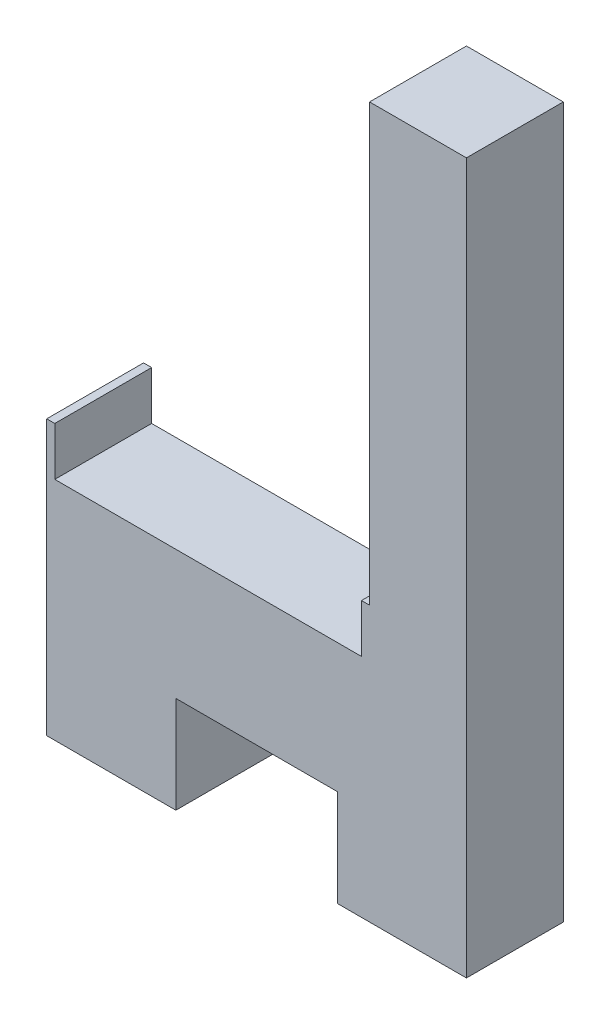
ISO-10303-21;
HEADER;
FILE_DESCRIPTION(('STEP AP214'),'2;1');
FILE_NAME('part.step','',(''),(''),'','','');
FILE_SCHEMA(('AUTOMOTIVE_DESIGN { 1 0 10303 214 1 1 1 1 }'));
ENDSEC;
DATA;
#1=APPLICATION_CONTEXT('core data for automotive mechanical design processes');
#2=APPLICATION_PROTOCOL_DEFINITION('international standard','automotive_design',2000,#1);
#3=PRODUCT_CONTEXT('',#1,'mechanical');
#4=PRODUCT('Part','Part','',(#3));
#5=PRODUCT_RELATED_PRODUCT_CATEGORY('part','',(#4));
#6=PRODUCT_DEFINITION_FORMATION('','',#4);
#7=PRODUCT_DEFINITION_CONTEXT('part definition',#1,'design');
#8=PRODUCT_DEFINITION('design','',#6,#7);
#9=PRODUCT_DEFINITION_SHAPE('','',#8);
#10=(LENGTH_UNIT() NAMED_UNIT(*) SI_UNIT(.MILLI.,.METRE.));
#11=(NAMED_UNIT(*) PLANE_ANGLE_UNIT() SI_UNIT($,.RADIAN.));
#12=(NAMED_UNIT(*) SI_UNIT($,.STERADIAN.) SOLID_ANGLE_UNIT());
#13=UNCERTAINTY_MEASURE_WITH_UNIT(LENGTH_MEASURE(1.E-05),#10,'distance_accuracy_value','');
#14=(GEOMETRIC_REPRESENTATION_CONTEXT(3) GLOBAL_UNCERTAINTY_ASSIGNED_CONTEXT((#13)) GLOBAL_UNIT_ASSIGNED_CONTEXT((#10,
#11,#12)) REPRESENTATION_CONTEXT('',''));
#15=CARTESIAN_POINT('',(0.,0.,0.));
#16=DIRECTION('',(0.,0.,1.));
#17=DIRECTION('',(1.,0.,0.));
#18=AXIS2_PLACEMENT_3D('',#15,#16,#17);
#19=CARTESIAN_POINT('',(5.,-22.,6.));
#20=DIRECTION('',(0.,1.,0.));
#21=DIRECTION('',(0.,0.,1.));
#22=AXIS2_PLACEMENT_3D('',#19,#20,#21);
#23=PLANE('',#22);
#24=DIRECTION('',(1.,0.,0.));
#25=VECTOR('',#24,1.);
#26=CARTESIAN_POINT('',(5.,-22.,0.));
#27=LINE('',#26,#25);
#28=CARTESIAN_POINT('',(5.,-22.,0.));
#29=VERTEX_POINT('',#28);
#30=CARTESIAN_POINT('',(13.,-22.,0.));
#31=VERTEX_POINT('',#30);
#32=EDGE_CURVE('E169',#29,#31,#27,.T.);
#33=ORIENTED_EDGE('',*,*,#32,.T.);
#34=DIRECTION('',(0.,0.,-1.));
#35=VECTOR('',#34,1.);
#36=CARTESIAN_POINT('',(13.,-22.,6.));
#37=LINE('',#36,#35);
#38=CARTESIAN_POINT('',(13.,-22.,6.));
#39=VERTEX_POINT('',#38);
#40=EDGE_CURVE('E11',#39,#31,#37,.T.);
#41=ORIENTED_EDGE('',*,*,#40,.F.);
#42=DIRECTION('',(1.,0.,0.));
#43=VECTOR('',#42,1.);
#44=CARTESIAN_POINT('',(5.,-22.,6.));
#45=LINE('',#44,#43);
#46=CARTESIAN_POINT('',(5.,-22.,6.));
#47=VERTEX_POINT('',#46);
#48=EDGE_CURVE('E195',#47,#39,#45,.T.);
#49=ORIENTED_EDGE('',*,*,#48,.F.);
#50=DIRECTION('',(0.,0.,-1.));
#51=VECTOR('',#50,1.);
#52=CARTESIAN_POINT('',(5.,-22.,6.));
#53=LINE('',#52,#51);
#54=EDGE_CURVE('E165',#47,#29,#53,.T.);
#55=ORIENTED_EDGE('',*,*,#54,.T.);
#56=EDGE_LOOP('',(#33,#41,#49,#55));
#57=FACE_BOUND('',#56,.T.);
#58=ADVANCED_FACE('F37',(#57),#23,.F.);
#59=CARTESIAN_POINT('',(13.,-22.,6.));
#60=DIRECTION('',(-1.,0.,0.));
#61=DIRECTION('',(0.,-1.,0.));
#62=AXIS2_PLACEMENT_3D('',#59,#60,#61);
#63=PLANE('',#62);
#64=DIRECTION('',(0.,1.,0.));
#65=VECTOR('',#64,1.);
#66=CARTESIAN_POINT('',(13.,-22.,0.));
#67=LINE('',#66,#65);
#68=CARTESIAN_POINT('',(13.,22.,0.));
#69=VERTEX_POINT('',#68);
#70=EDGE_CURVE('E172',#31,#69,#67,.T.);
#71=ORIENTED_EDGE('',*,*,#70,.T.);
#72=DIRECTION('',(0.,0.,-1.));
#73=VECTOR('',#72,1.);
#74=CARTESIAN_POINT('',(13.,22.,6.));
#75=LINE('',#74,#73);
#76=CARTESIAN_POINT('',(13.,22.,6.));
#77=VERTEX_POINT('',#76);
#78=EDGE_CURVE('E45',#77,#69,#75,.T.);
#79=ORIENTED_EDGE('',*,*,#78,.F.);
#80=DIRECTION('',(0.,1.,0.));
#81=VECTOR('',#80,1.);
#82=CARTESIAN_POINT('',(13.,-22.,6.));
#83=LINE('',#82,#81);
#84=EDGE_CURVE('E114',#39,#77,#83,.T.);
#85=ORIENTED_EDGE('',*,*,#84,.F.);
#86=ORIENTED_EDGE('',*,*,#40,.T.);
#87=EDGE_LOOP('',(#71,#79,#85,#86));
#88=FACE_BOUND('',#87,.T.);
#89=ADVANCED_FACE('F283',(#88),#63,.F.);
#90=CARTESIAN_POINT('',(13.,22.,6.));
#91=DIRECTION('',(0.,-1.,0.));
#92=DIRECTION('',(0.,0.,-1.));
#93=AXIS2_PLACEMENT_3D('',#90,#91,#92);
#94=PLANE('',#93);
#95=DIRECTION('',(-1.,0.,0.));
#96=VECTOR('',#95,1.);
#97=CARTESIAN_POINT('',(13.,22.,0.));
#98=LINE('',#97,#96);
#99=CARTESIAN_POINT('',(7.,22.,0.));
#100=VERTEX_POINT('',#99);
#101=EDGE_CURVE('E174',#69,#100,#98,.T.);
#102=ORIENTED_EDGE('',*,*,#101,.T.);
#103=DIRECTION('',(0.,0.,-1.));
#104=VECTOR('',#103,1.);
#105=CARTESIAN_POINT('',(7.,22.,6.));
#106=LINE('',#105,#104);
#107=CARTESIAN_POINT('',(7.,22.,6.));
#108=VERTEX_POINT('',#107);
#109=EDGE_CURVE('E220',#108,#100,#106,.T.);
#110=ORIENTED_EDGE('',*,*,#109,.F.);
#111=DIRECTION('',(-1.,0.,0.));
#112=VECTOR('',#111,1.);
#113=CARTESIAN_POINT('',(13.,22.,6.));
#114=LINE('',#113,#112);
#115=EDGE_CURVE('E228',#77,#108,#114,.T.);
#116=ORIENTED_EDGE('',*,*,#115,.F.);
#117=ORIENTED_EDGE('',*,*,#78,.T.);
#118=EDGE_LOOP('',(#102,#110,#116,#117));
#119=FACE_BOUND('',#118,.T.);
#120=ADVANCED_FACE('F226',(#119),#94,.F.);
#121=CARTESIAN_POINT('',(7.,22.,6.));
#122=DIRECTION('',(1.,0.,0.));
#123=DIRECTION('',(0.,0.,-1.));
#124=AXIS2_PLACEMENT_3D('',#121,#122,#123);
#125=PLANE('',#124);
#126=DIRECTION('',(0.,-1.,0.));
#127=VECTOR('',#126,1.);
#128=CARTESIAN_POINT('',(7.,22.,0.));
#129=LINE('',#128,#127);
#130=CARTESIAN_POINT('',(7.,-5.,0.));
#131=VERTEX_POINT('',#130);
#132=EDGE_CURVE('E176',#100,#131,#129,.T.);
#133=ORIENTED_EDGE('',*,*,#132,.T.);
#134=DIRECTION('',(0.,0.,-1.));
#135=VECTOR('',#134,1.);
#136=CARTESIAN_POINT('',(7.,-5.,6.));
#137=LINE('',#136,#135);
#138=CARTESIAN_POINT('',(7.,-5.,6.));
#139=VERTEX_POINT('',#138);
#140=EDGE_CURVE('E217',#139,#131,#137,.T.);
#141=ORIENTED_EDGE('',*,*,#140,.F.);
#142=DIRECTION('',(0.,-1.,0.));
#143=VECTOR('',#142,1.);
#144=CARTESIAN_POINT('',(7.,22.,6.));
#145=LINE('',#144,#143);
#146=EDGE_CURVE('E246',#108,#139,#145,.T.);
#147=ORIENTED_EDGE('',*,*,#146,.F.);
#148=ORIENTED_EDGE('',*,*,#109,.T.);
#149=EDGE_LOOP('',(#133,#141,#147,#148));
#150=FACE_BOUND('',#149,.T.);
#151=ADVANCED_FACE('F237',(#150),#125,.F.);
#152=CARTESIAN_POINT('',(7.,-5.,6.));
#153=DIRECTION('',(0.,-1.,0.));
#154=DIRECTION('',(0.,0.,-1.));
#155=AXIS2_PLACEMENT_3D('',#152,#153,#154);
#156=PLANE('',#155);
#157=DIRECTION('',(-1.,0.,0.));
#158=VECTOR('',#157,1.);
#159=CARTESIAN_POINT('',(7.,-5.,0.));
#160=LINE('',#159,#158);
#161=CARTESIAN_POINT('',(6.5,-5.,0.));
#162=VERTEX_POINT('',#161);
#163=EDGE_CURVE('E178',#131,#162,#160,.T.);
#164=ORIENTED_EDGE('',*,*,#163,.T.);
#165=DIRECTION('',(0.,0.,-1.));
#166=VECTOR('',#165,1.);
#167=CARTESIAN_POINT('',(6.5,-5.,6.));
#168=LINE('',#167,#166);
#169=CARTESIAN_POINT('',(6.5,-5.,6.));
#170=VERTEX_POINT('',#169);
#171=EDGE_CURVE('E214',#170,#162,#168,.T.);
#172=ORIENTED_EDGE('',*,*,#171,.F.);
#173=DIRECTION('',(-1.,0.,0.));
#174=VECTOR('',#173,1.);
#175=CARTESIAN_POINT('',(7.,-5.,6.));
#176=LINE('',#175,#174);
#177=EDGE_CURVE('E243',#139,#170,#176,.T.);
#178=ORIENTED_EDGE('',*,*,#177,.F.);
#179=ORIENTED_EDGE('',*,*,#140,.T.);
#180=EDGE_LOOP('',(#164,#172,#178,#179));
#181=FACE_BOUND('',#180,.T.);
#182=ADVANCED_FACE('F241',(#181),#156,.F.);
#183=CARTESIAN_POINT('',(6.5,-5.,6.));
#184=DIRECTION('',(1.,0.,0.));
#185=DIRECTION('',(0.,1.,0.));
#186=AXIS2_PLACEMENT_3D('',#183,#184,#185);
#187=PLANE('',#186);
#188=DIRECTION('',(0.,-1.,0.));
#189=VECTOR('',#188,1.);
#190=CARTESIAN_POINT('',(6.5,-5.,0.));
#191=LINE('',#190,#189);
#192=CARTESIAN_POINT('',(6.5,-7.99999999999999,0.));
#193=VERTEX_POINT('',#192);
#194=EDGE_CURVE('E180',#162,#193,#191,.T.);
#195=ORIENTED_EDGE('',*,*,#194,.T.);
#196=DIRECTION('',(0.,0.,-1.));
#197=VECTOR('',#196,1.);
#198=CARTESIAN_POINT('',(6.5,-7.99999999999999,6.));
#199=LINE('',#198,#197);
#200=CARTESIAN_POINT('',(6.5,-7.99999999999999,6.));
#201=VERTEX_POINT('',#200);
#202=EDGE_CURVE('E211',#201,#193,#199,.T.);
#203=ORIENTED_EDGE('',*,*,#202,.F.);
#204=DIRECTION('',(0.,-1.,0.));
#205=VECTOR('',#204,1.);
#206=CARTESIAN_POINT('',(6.5,-5.,6.));
#207=LINE('',#206,#205);
#208=EDGE_CURVE('E245',#170,#201,#207,.T.);
#209=ORIENTED_EDGE('',*,*,#208,.F.);
#210=ORIENTED_EDGE('',*,*,#171,.T.);
#211=EDGE_LOOP('',(#195,#203,#209,#210));
#212=FACE_BOUND('',#211,.T.);
#213=ADVANCED_FACE('F296',(#212),#187,.F.);
#214=CARTESIAN_POINT('',(6.5,-7.99999999999999,6.));
#215=DIRECTION('',(0.,-1.,0.));
#216=DIRECTION('',(1.,0.,0.));
#217=AXIS2_PLACEMENT_3D('',#214,#215,#216);
#218=PLANE('',#217);
#219=DIRECTION('',(-1.,0.,0.));
#220=VECTOR('',#219,1.);
#221=CARTESIAN_POINT('',(6.5,-7.99999999999999,0.));
#222=LINE('',#221,#220);
#223=CARTESIAN_POINT('',(-12.5,-7.99999999999999,0.));
#224=VERTEX_POINT('',#223);
#225=EDGE_CURVE('E182',#193,#224,#222,.T.);
#226=ORIENTED_EDGE('',*,*,#225,.T.);
#227=DIRECTION('',(0.,0.,-1.));
#228=VECTOR('',#227,1.);
#229=CARTESIAN_POINT('',(-12.5,-7.99999999999999,6.));
#230=LINE('',#229,#228);
#231=CARTESIAN_POINT('',(-12.5,-7.99999999999999,6.));
#232=VERTEX_POINT('',#231);
#233=EDGE_CURVE('E208',#232,#224,#230,.T.);
#234=ORIENTED_EDGE('',*,*,#233,.F.);
#235=DIRECTION('',(-1.,0.,0.));
#236=VECTOR('',#235,1.);
#237=CARTESIAN_POINT('',(6.5,-7.99999999999999,6.));
#238=LINE('',#237,#236);
#239=EDGE_CURVE('E248',#201,#232,#238,.T.);
#240=ORIENTED_EDGE('',*,*,#239,.F.);
#241=ORIENTED_EDGE('',*,*,#202,.T.);
#242=EDGE_LOOP('',(#226,#234,#240,#241));
#243=FACE_BOUND('',#242,.T.);
#244=ADVANCED_FACE('F299',(#243),#218,.F.);
#245=CARTESIAN_POINT('',(-12.5,-7.99999999999999,6.));
#246=DIRECTION('',(-1.,0.,0.));
#247=DIRECTION('',(0.,-1.,0.));
#248=AXIS2_PLACEMENT_3D('',#245,#246,#247);
#249=PLANE('',#248);
#250=DIRECTION('',(0.,1.,0.));
#251=VECTOR('',#250,1.);
#252=CARTESIAN_POINT('',(-12.5,-7.99999999999999,0.));
#253=LINE('',#252,#251);
#254=CARTESIAN_POINT('',(-12.5,-5.,0.));
#255=VERTEX_POINT('',#254);
#256=EDGE_CURVE('E184',#224,#255,#253,.T.);
#257=ORIENTED_EDGE('',*,*,#256,.T.);
#258=DIRECTION('',(0.,0.,-1.));
#259=VECTOR('',#258,1.);
#260=CARTESIAN_POINT('',(-12.5,-5.,6.));
#261=LINE('',#260,#259);
#262=CARTESIAN_POINT('',(-12.5,-5.,6.));
#263=VERTEX_POINT('',#262);
#264=EDGE_CURVE('E205',#263,#255,#261,.T.);
#265=ORIENTED_EDGE('',*,*,#264,.F.);
#266=DIRECTION('',(0.,1.,0.));
#267=VECTOR('',#266,1.);
#268=CARTESIAN_POINT('',(-12.5,-7.99999999999999,6.));
#269=LINE('',#268,#267);
#270=EDGE_CURVE('E254',#232,#263,#269,.T.);
#271=ORIENTED_EDGE('',*,*,#270,.F.);
#272=ORIENTED_EDGE('',*,*,#233,.T.);
#273=EDGE_LOOP('',(#257,#265,#271,#272));
#274=FACE_BOUND('',#273,.T.);
#275=ADVANCED_FACE('F303',(#274),#249,.F.);
#276=CARTESIAN_POINT('',(-12.5,-5.,6.));
#277=DIRECTION('',(0.,-1.,0.));
#278=DIRECTION('',(0.,0.,-1.));
#279=AXIS2_PLACEMENT_3D('',#276,#277,#278);
#280=PLANE('',#279);
#281=DIRECTION('',(-1.,0.,0.));
#282=VECTOR('',#281,1.);
#283=CARTESIAN_POINT('',(-12.5,-5.,0.));
#284=LINE('',#283,#282);
#285=CARTESIAN_POINT('',(-13.,-5.,0.));
#286=VERTEX_POINT('',#285);
#287=EDGE_CURVE('E186',#255,#286,#284,.T.);
#288=ORIENTED_EDGE('',*,*,#287,.T.);
#289=DIRECTION('',(0.,0.,-1.));
#290=VECTOR('',#289,1.);
#291=CARTESIAN_POINT('',(-13.,-5.,6.));
#292=LINE('',#291,#290);
#293=CARTESIAN_POINT('',(-13.,-5.,6.));
#294=VERTEX_POINT('',#293);
#295=EDGE_CURVE('E202',#294,#286,#292,.T.);
#296=ORIENTED_EDGE('',*,*,#295,.F.);
#297=DIRECTION('',(-1.,0.,0.));
#298=VECTOR('',#297,1.);
#299=CARTESIAN_POINT('',(-12.5,-5.,6.));
#300=LINE('',#299,#298);
#301=EDGE_CURVE('E256',#263,#294,#300,.T.);
#302=ORIENTED_EDGE('',*,*,#301,.F.);
#303=ORIENTED_EDGE('',*,*,#264,.T.);
#304=EDGE_LOOP('',(#288,#296,#302,#303));
#305=FACE_BOUND('',#304,.T.);
#306=ADVANCED_FACE('F307',(#305),#280,.F.);
#307=CARTESIAN_POINT('',(-13.,-5.,6.));
#308=DIRECTION('',(1.,0.,0.));
#309=DIRECTION('',(0.,0.,-1.));
#310=AXIS2_PLACEMENT_3D('',#307,#308,#309);
#311=PLANE('',#310);
#312=DIRECTION('',(0.,-1.,0.));
#313=VECTOR('',#312,1.);
#314=CARTESIAN_POINT('',(-13.,-5.,0.));
#315=LINE('',#314,#313);
#316=CARTESIAN_POINT('',(-13.,-22.,0.));
#317=VERTEX_POINT('',#316);
#318=EDGE_CURVE('E188',#286,#317,#315,.T.);
#319=ORIENTED_EDGE('',*,*,#318,.T.);
#320=DIRECTION('',(0.,0.,-1.));
#321=VECTOR('',#320,1.);
#322=CARTESIAN_POINT('',(-13.,-22.,6.));
#323=LINE('',#322,#321);
#324=CARTESIAN_POINT('',(-13.,-22.,6.));
#325=VERTEX_POINT('',#324);
#326=EDGE_CURVE('E199',#325,#317,#323,.T.);
#327=ORIENTED_EDGE('',*,*,#326,.F.);
#328=DIRECTION('',(0.,-1.,0.));
#329=VECTOR('',#328,1.);
#330=CARTESIAN_POINT('',(-13.,-5.,6.));
#331=LINE('',#330,#329);
#332=EDGE_CURVE('E258',#294,#325,#331,.T.);
#333=ORIENTED_EDGE('',*,*,#332,.F.);
#334=ORIENTED_EDGE('',*,*,#295,.T.);
#335=EDGE_LOOP('',(#319,#327,#333,#334));
#336=FACE_BOUND('',#335,.T.);
#337=ADVANCED_FACE('F264',(#336),#311,.F.);
#338=CARTESIAN_POINT('',(-13.,-22.,6.));
#339=DIRECTION('',(0.,1.,0.));
#340=DIRECTION('',(0.,0.,1.));
#341=AXIS2_PLACEMENT_3D('',#338,#339,#340);
#342=PLANE('',#341);
#343=DIRECTION('',(1.,0.,0.));
#344=VECTOR('',#343,1.);
#345=CARTESIAN_POINT('',(-13.,-22.,0.));
#346=LINE('',#345,#344);
#347=CARTESIAN_POINT('',(-5.,-22.,0.));
#348=VERTEX_POINT('',#347);
#349=EDGE_CURVE('E190',#317,#348,#346,.T.);
#350=ORIENTED_EDGE('',*,*,#349,.T.);
#351=DIRECTION('',(0.,0.,-1.));
#352=VECTOR('',#351,1.);
#353=CARTESIAN_POINT('',(-5.,-22.,6.));
#354=LINE('',#353,#352);
#355=CARTESIAN_POINT('',(-5.,-22.,6.));
#356=VERTEX_POINT('',#355);
#357=EDGE_CURVE('E160',#356,#348,#354,.T.);
#358=ORIENTED_EDGE('',*,*,#357,.F.);
#359=DIRECTION('',(1.,0.,0.));
#360=VECTOR('',#359,1.);
#361=CARTESIAN_POINT('',(-13.,-22.,6.));
#362=LINE('',#361,#360);
#363=EDGE_CURVE('E151',#325,#356,#362,.T.);
#364=ORIENTED_EDGE('',*,*,#363,.F.);
#365=ORIENTED_EDGE('',*,*,#326,.T.);
#366=EDGE_LOOP('',(#350,#358,#364,#365));
#367=FACE_BOUND('',#366,.T.);
#368=ADVANCED_FACE('F268',(#367),#342,.F.);
#369=CARTESIAN_POINT('',(-5.,-22.,6.));
#370=DIRECTION('',(-1.,0.,0.));
#371=DIRECTION('',(0.,0.,1.));
#372=AXIS2_PLACEMENT_3D('',#369,#370,#371);
#373=PLANE('',#372);
#374=DIRECTION('',(0.,1.,0.));
#375=VECTOR('',#374,1.);
#376=CARTESIAN_POINT('',(-5.,-22.,0.));
#377=LINE('',#376,#375);
#378=CARTESIAN_POINT('',(-5.,-16.,0.));
#379=VERTEX_POINT('',#378);
#380=EDGE_CURVE('E159',#348,#379,#377,.T.);
#381=ORIENTED_EDGE('',*,*,#380,.T.);
#382=DIRECTION('',(0.,0.,-1.));
#383=VECTOR('',#382,1.);
#384=CARTESIAN_POINT('',(-5.,-16.,6.));
#385=LINE('',#384,#383);
#386=CARTESIAN_POINT('',(-5.,-16.,6.));
#387=VERTEX_POINT('',#386);
#388=EDGE_CURVE('E156',#387,#379,#385,.T.);
#389=ORIENTED_EDGE('',*,*,#388,.F.);
#390=DIRECTION('',(0.,1.,0.));
#391=VECTOR('',#390,1.);
#392=CARTESIAN_POINT('',(-5.,-22.,6.));
#393=LINE('',#392,#391);
#394=EDGE_CURVE('E145',#356,#387,#393,.T.);
#395=ORIENTED_EDGE('',*,*,#394,.F.);
#396=ORIENTED_EDGE('',*,*,#357,.T.);
#397=EDGE_LOOP('',(#381,#389,#395,#396));
#398=FACE_BOUND('',#397,.T.);
#399=ADVANCED_FACE('F157',(#398),#373,.F.);
#400=CARTESIAN_POINT('',(-5.,-16.,6.));
#401=DIRECTION('',(0.,1.,0.));
#402=DIRECTION('',(0.,0.,1.));
#403=AXIS2_PLACEMENT_3D('',#400,#401,#402);
#404=PLANE('',#403);
#405=DIRECTION('',(1.,0.,0.));
#406=VECTOR('',#405,1.);
#407=CARTESIAN_POINT('',(-5.,-16.,0.));
#408=LINE('',#407,#406);
#409=CARTESIAN_POINT('',(5.,-16.,0.));
#410=VERTEX_POINT('',#409);
#411=EDGE_CURVE('E100',#379,#410,#408,.T.);
#412=ORIENTED_EDGE('',*,*,#411,.T.);
#413=DIRECTION('',(0.,0.,-1.));
#414=VECTOR('',#413,1.);
#415=CARTESIAN_POINT('',(5.,-16.,6.));
#416=LINE('',#415,#414);
#417=CARTESIAN_POINT('',(5.,-16.,6.));
#418=VERTEX_POINT('',#417);
#419=EDGE_CURVE('E161',#418,#410,#416,.T.);
#420=ORIENTED_EDGE('',*,*,#419,.F.);
#421=DIRECTION('',(1.,0.,0.));
#422=VECTOR('',#421,1.);
#423=CARTESIAN_POINT('',(-5.,-16.,6.));
#424=LINE('',#423,#422);
#425=EDGE_CURVE('E149',#387,#418,#424,.T.);
#426=ORIENTED_EDGE('',*,*,#425,.F.);
#427=ORIENTED_EDGE('',*,*,#388,.T.);
#428=EDGE_LOOP('',(#412,#420,#426,#427));
#429=FACE_BOUND('',#428,.T.);
#430=ADVANCED_FACE('F163',(#429),#404,.F.);
#431=CARTESIAN_POINT('',(5.,-16.,6.));
#432=DIRECTION('',(1.,0.,0.));
#433=DIRECTION('',(0.,0.,-1.));
#434=AXIS2_PLACEMENT_3D('',#431,#432,#433);
#435=PLANE('',#434);
#436=DIRECTION('',(0.,-1.,0.));
#437=VECTOR('',#436,1.);
#438=CARTESIAN_POINT('',(5.,-16.,0.));
#439=LINE('',#438,#437);
#440=EDGE_CURVE('E106',#410,#29,#439,.T.);
#441=ORIENTED_EDGE('',*,*,#440,.T.);
#442=ORIENTED_EDGE('',*,*,#54,.F.);
#443=DIRECTION('',(0.,-1.,0.));
#444=VECTOR('',#443,1.);
#445=CARTESIAN_POINT('',(5.,-16.,6.));
#446=LINE('',#445,#444);
#447=EDGE_CURVE('E53',#418,#47,#446,.T.);
#448=ORIENTED_EDGE('',*,*,#447,.F.);
#449=ORIENTED_EDGE('',*,*,#419,.T.);
#450=EDGE_LOOP('',(#441,#442,#448,#449));
#451=FACE_BOUND('',#450,.T.);
#452=ADVANCED_FACE('F272',(#451),#435,.F.);
#453=CARTESIAN_POINT('',(0.,0.,6.));
#454=DIRECTION('',(0.,0.,1.));
#455=DIRECTION('',(1.,0.,0.));
#456=AXIS2_PLACEMENT_3D('',#453,#454,#455);
#457=PLANE('',#456);
#458=ORIENTED_EDGE('',*,*,#48,.T.);
#459=ORIENTED_EDGE('',*,*,#84,.T.);
#460=ORIENTED_EDGE('',*,*,#115,.T.);
#461=ORIENTED_EDGE('',*,*,#146,.T.);
#462=ORIENTED_EDGE('',*,*,#177,.T.);
#463=ORIENTED_EDGE('',*,*,#208,.T.);
#464=ORIENTED_EDGE('',*,*,#239,.T.);
#465=ORIENTED_EDGE('',*,*,#270,.T.);
#466=ORIENTED_EDGE('',*,*,#301,.T.);
#467=ORIENTED_EDGE('',*,*,#332,.T.);
#468=ORIENTED_EDGE('',*,*,#363,.T.);
#469=ORIENTED_EDGE('',*,*,#394,.T.);
#470=ORIENTED_EDGE('',*,*,#425,.T.);
#471=ORIENTED_EDGE('',*,*,#447,.T.);
#472=EDGE_LOOP('',(#458,#459,#460,#461,#462,#463,#464,#465,#466,#467,#468,#469,#470,#471));
#473=FACE_BOUND('',#472,.T.);
#474=ADVANCED_FACE('F147',(#473),#457,.T.);
#475=CARTESIAN_POINT('',(0.,0.,0.));
#476=DIRECTION('',(0.,0.,1.));
#477=DIRECTION('',(1.,0.,0.));
#478=AXIS2_PLACEMENT_3D('',#475,#476,#477);
#479=PLANE('',#478);
#480=ORIENTED_EDGE('',*,*,#32,.F.);
#481=ORIENTED_EDGE('',*,*,#440,.F.);
#482=ORIENTED_EDGE('',*,*,#411,.F.);
#483=ORIENTED_EDGE('',*,*,#380,.F.);
#484=ORIENTED_EDGE('',*,*,#349,.F.);
#485=ORIENTED_EDGE('',*,*,#318,.F.);
#486=ORIENTED_EDGE('',*,*,#287,.F.);
#487=ORIENTED_EDGE('',*,*,#256,.F.);
#488=ORIENTED_EDGE('',*,*,#225,.F.);
#489=ORIENTED_EDGE('',*,*,#194,.F.);
#490=ORIENTED_EDGE('',*,*,#163,.F.);
#491=ORIENTED_EDGE('',*,*,#132,.F.);
#492=ORIENTED_EDGE('',*,*,#101,.F.);
#493=ORIENTED_EDGE('',*,*,#70,.F.);
#494=EDGE_LOOP('',(#480,#481,#482,#483,#484,#485,#486,#487,#488,#489,#490,#491,#492,#493));
#495=FACE_BOUND('',#494,.T.);
#496=ADVANCED_FACE('F232',(#495),#479,.F.);
#497=CLOSED_SHELL('',(#58,#89,#120,#151,#182,#213,#244,#275,#306,#337,#368,#399,#430,#452,#474,#496));
#498=MANIFOLD_SOLID_BREP('B2',#497);
#499=ADVANCED_BREP_SHAPE_REPRESENTATION('',(#18,#498),#14);
#500=SHAPE_DEFINITION_REPRESENTATION(#9,#499);
ENDSEC;
END-ISO-10303-21;
